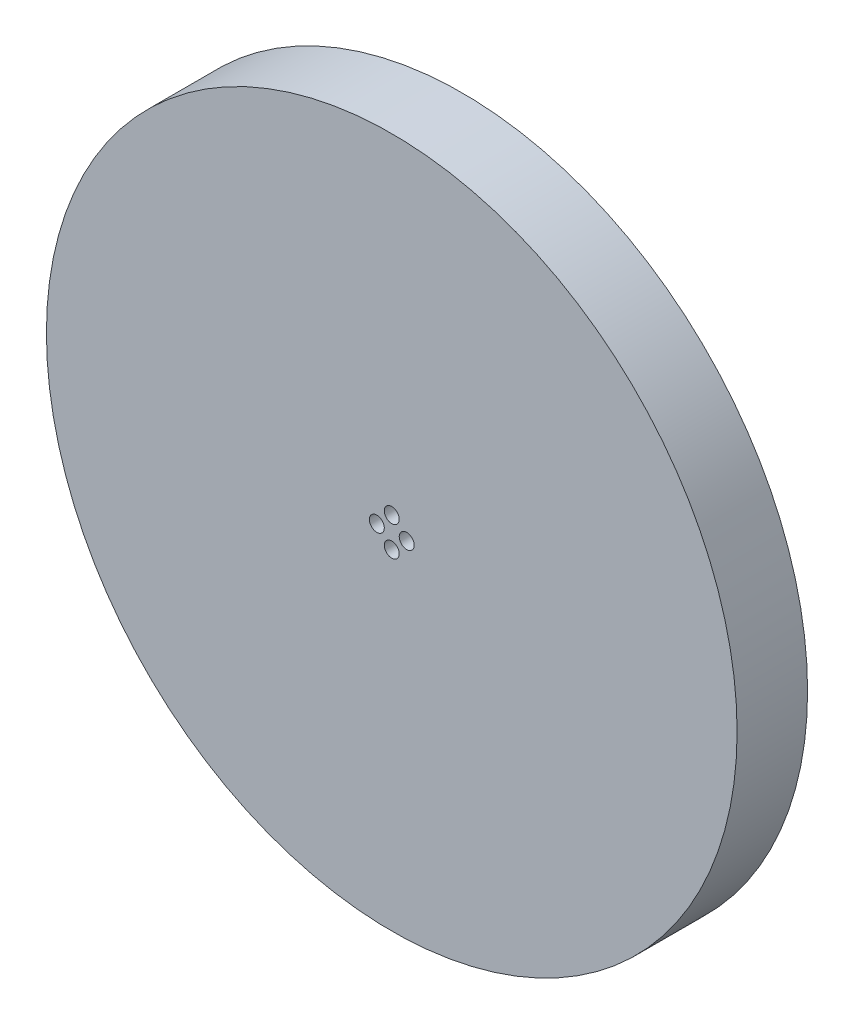
ISO-10303-21;
HEADER;
FILE_DESCRIPTION(('STEP AP214'),'2;1');
FILE_NAME('part.step','',(''),(''),'','','');
FILE_SCHEMA(('AUTOMOTIVE_DESIGN { 1 0 10303 214 1 1 1 1 }'));
ENDSEC;
DATA;
#1=APPLICATION_CONTEXT('core data for automotive mechanical design processes');
#2=APPLICATION_PROTOCOL_DEFINITION('international standard','automotive_design',2000,#1);
#3=PRODUCT_CONTEXT('',#1,'mechanical');
#4=PRODUCT('Part','Part','',(#3));
#5=PRODUCT_RELATED_PRODUCT_CATEGORY('part','',(#4));
#6=PRODUCT_DEFINITION_FORMATION('','',#4);
#7=PRODUCT_DEFINITION_CONTEXT('part definition',#1,'design');
#8=PRODUCT_DEFINITION('design','',#6,#7);
#9=PRODUCT_DEFINITION_SHAPE('','',#8);
#10=(LENGTH_UNIT() NAMED_UNIT(*) SI_UNIT(.MILLI.,.METRE.));
#11=(NAMED_UNIT(*) PLANE_ANGLE_UNIT() SI_UNIT($,.RADIAN.));
#12=(NAMED_UNIT(*) SI_UNIT($,.STERADIAN.) SOLID_ANGLE_UNIT());
#13=UNCERTAINTY_MEASURE_WITH_UNIT(LENGTH_MEASURE(1.E-05),#10,'distance_accuracy_value','');
#14=(GEOMETRIC_REPRESENTATION_CONTEXT(3) GLOBAL_UNCERTAINTY_ASSIGNED_CONTEXT((#13)) GLOBAL_UNIT_ASSIGNED_CONTEXT((#10,
#11,#12)) REPRESENTATION_CONTEXT('',''));
#15=CARTESIAN_POINT('',(0.,0.,0.));
#16=DIRECTION('',(0.,0.,1.));
#17=DIRECTION('',(1.,0.,0.));
#18=AXIS2_PLACEMENT_3D('',#15,#16,#17);
#19=CARTESIAN_POINT('',(0.,0.,5.));
#20=DIRECTION('',(0.,0.,-1.));
#21=DIRECTION('',(-1.,0.,0.));
#22=AXIS2_PLACEMENT_3D('',#19,#20,#21);
#23=CYLINDRICAL_SURFACE('',#22,24.5);
#24=CARTESIAN_POINT('',(0.,0.,5.));
#25=DIRECTION('',(0.,0.,1.));
#26=DIRECTION('',(1.,0.,0.));
#27=AXIS2_PLACEMENT_3D('',#24,#25,#26);
#28=CIRCLE('',#27,24.5);
#29=CARTESIAN_POINT('',(24.5,0.,5.));
#30=VERTEX_POINT('',#29);
#31=EDGE_CURVE('E10',#30,#30,#28,.T.);
#32=ORIENTED_EDGE('',*,*,#31,.F.);
#33=EDGE_LOOP('',(#32));
#34=FACE_BOUND('',#33,.T.);
#35=CARTESIAN_POINT('',(0.,0.,0.));
#36=DIRECTION('',(0.,0.,1.));
#37=DIRECTION('',(1.,0.,0.));
#38=AXIS2_PLACEMENT_3D('',#35,#36,#37);
#39=CIRCLE('',#38,24.5);
#40=CARTESIAN_POINT('',(24.5,0.,0.));
#41=VERTEX_POINT('',#40);
#42=EDGE_CURVE('E42',#41,#41,#39,.T.);
#43=ORIENTED_EDGE('',*,*,#42,.T.);
#44=EDGE_LOOP('',(#43));
#45=FACE_BOUND('',#44,.T.);
#46=ADVANCED_FACE('F39',(#34,#45),#23,.T.);
#47=CARTESIAN_POINT('',(0.,0.,5.));
#48=DIRECTION('',(0.,0.,1.));
#49=DIRECTION('',(1.,0.,0.));
#50=AXIS2_PLACEMENT_3D('',#47,#48,#49);
#51=PLANE('',#50);
#52=CARTESIAN_POINT('',(0.,-1.06,5.));
#53=DIRECTION('',(0.,0.,1.));
#54=DIRECTION('',(-1.,0.,0.));
#55=AXIS2_PLACEMENT_3D('',#52,#53,#54);
#56=CIRCLE('',#55,0.53);
#57=CARTESIAN_POINT('',(-0.53,-1.06,5.));
#58=VERTEX_POINT('',#57);
#59=EDGE_CURVE('E68',#58,#58,#56,.T.);
#60=ORIENTED_EDGE('',*,*,#59,.F.);
#61=EDGE_LOOP('',(#60));
#62=FACE_BOUND('',#61,.T.);
#63=CARTESIAN_POINT('',(-1.06,0.,5.));
#64=DIRECTION('',(0.,0.,1.));
#65=DIRECTION('',(0.,1.,0.));
#66=AXIS2_PLACEMENT_3D('',#63,#64,#65);
#67=CIRCLE('',#66,0.53);
#68=CARTESIAN_POINT('',(-1.05999999999999,0.530000000000011,5.));
#69=VERTEX_POINT('',#68);
#70=EDGE_CURVE('E76',#69,#69,#67,.T.);
#71=ORIENTED_EDGE('',*,*,#70,.F.);
#72=EDGE_LOOP('',(#71));
#73=FACE_BOUND('',#72,.T.);
#74=CARTESIAN_POINT('',(1.06,0.,5.));
#75=DIRECTION('',(0.,0.,1.));
#76=DIRECTION('',(0.,-1.,0.));
#77=AXIS2_PLACEMENT_3D('',#74,#75,#76);
#78=CIRCLE('',#77,0.53);
#79=CARTESIAN_POINT('',(1.06,-0.530000000000004,5.));
#80=VERTEX_POINT('',#79);
#81=EDGE_CURVE('E60',#80,#80,#78,.T.);
#82=ORIENTED_EDGE('',*,*,#81,.F.);
#83=EDGE_LOOP('',(#82));
#84=FACE_BOUND('',#83,.T.);
#85=CARTESIAN_POINT('',(0.,1.06,5.));
#86=DIRECTION('',(0.,0.,1.));
#87=DIRECTION('',(1.,0.,0.));
#88=AXIS2_PLACEMENT_3D('',#85,#86,#87);
#89=CIRCLE('',#88,0.53);
#90=CARTESIAN_POINT('',(0.53,1.06,5.));
#91=VERTEX_POINT('',#90);
#92=EDGE_CURVE('E56',#91,#91,#89,.T.);
#93=ORIENTED_EDGE('',*,*,#92,.F.);
#94=EDGE_LOOP('',(#93));
#95=FACE_BOUND('',#94,.T.);
#96=ORIENTED_EDGE('',*,*,#31,.T.);
#97=EDGE_LOOP('',(#96));
#98=FACE_BOUND('',#97,.T.);
#99=ADVANCED_FACE('F92',(#62,#73,#84,#95,#98),#51,.T.);
#100=CARTESIAN_POINT('',(0.,0.,0.));
#101=DIRECTION('',(0.,0.,1.));
#102=DIRECTION('',(1.,0.,0.));
#103=AXIS2_PLACEMENT_3D('',#100,#101,#102);
#104=PLANE('',#103);
#105=CARTESIAN_POINT('',(0.,-1.06,0.));
#106=DIRECTION('',(0.,0.,1.));
#107=DIRECTION('',(-1.,0.,0.));
#108=AXIS2_PLACEMENT_3D('',#105,#106,#107);
#109=CIRCLE('',#108,0.53);
#110=CARTESIAN_POINT('',(-0.53,-1.06,0.));
#111=VERTEX_POINT('',#110);
#112=EDGE_CURVE('E72',#111,#111,#109,.F.);
#113=ORIENTED_EDGE('',*,*,#112,.F.);
#114=EDGE_LOOP('',(#113));
#115=FACE_BOUND('',#114,.T.);
#116=CARTESIAN_POINT('',(-1.06,0.,0.));
#117=DIRECTION('',(0.,0.,1.));
#118=DIRECTION('',(0.,1.,0.));
#119=AXIS2_PLACEMENT_3D('',#116,#117,#118);
#120=CIRCLE('',#119,0.53);
#121=CARTESIAN_POINT('',(-1.05999999999999,0.530000000000011,0.));
#122=VERTEX_POINT('',#121);
#123=EDGE_CURVE('E80',#122,#122,#120,.F.);
#124=ORIENTED_EDGE('',*,*,#123,.F.);
#125=EDGE_LOOP('',(#124));
#126=FACE_BOUND('',#125,.T.);
#127=CARTESIAN_POINT('',(1.06,0.,0.));
#128=DIRECTION('',(0.,0.,1.));
#129=DIRECTION('',(0.,-1.,0.));
#130=AXIS2_PLACEMENT_3D('',#127,#128,#129);
#131=CIRCLE('',#130,0.53);
#132=CARTESIAN_POINT('',(1.06,-0.530000000000004,0.));
#133=VERTEX_POINT('',#132);
#134=EDGE_CURVE('E64',#133,#133,#131,.F.);
#135=ORIENTED_EDGE('',*,*,#134,.F.);
#136=EDGE_LOOP('',(#135));
#137=FACE_BOUND('',#136,.T.);
#138=CARTESIAN_POINT('',(0.,1.06,0.));
#139=DIRECTION('',(0.,0.,1.));
#140=DIRECTION('',(1.,0.,0.));
#141=AXIS2_PLACEMENT_3D('',#138,#139,#140);
#142=CIRCLE('',#141,0.53);
#143=CARTESIAN_POINT('',(0.53,1.06,0.));
#144=VERTEX_POINT('',#143);
#145=EDGE_CURVE('E51',#144,#144,#142,.F.);
#146=ORIENTED_EDGE('',*,*,#145,.F.);
#147=EDGE_LOOP('',(#146));
#148=FACE_BOUND('',#147,.T.);
#149=ORIENTED_EDGE('',*,*,#42,.F.);
#150=EDGE_LOOP('',(#149));
#151=FACE_BOUND('',#150,.T.);
#152=ADVANCED_FACE('F88',(#115,#126,#137,#148,#151),#104,.F.);
#153=CARTESIAN_POINT('',(0.,1.06,-1.49906637611548));
#154=DIRECTION('',(0.,0.,1.));
#155=DIRECTION('',(1.,0.,0.));
#156=AXIS2_PLACEMENT_3D('',#153,#154,#155);
#157=CYLINDRICAL_SURFACE('',#156,0.53);
#158=ORIENTED_EDGE('',*,*,#145,.T.);
#159=EDGE_LOOP('',(#158));
#160=FACE_BOUND('',#159,.T.);
#161=ORIENTED_EDGE('',*,*,#92,.T.);
#162=EDGE_LOOP('',(#161));
#163=FACE_BOUND('',#162,.T.);
#164=ADVANCED_FACE('F91',(#160,#163),#157,.F.);
#165=CARTESIAN_POINT('',(1.06,0.,-1.49906637611548));
#166=DIRECTION('',(0.,0.,1.));
#167=DIRECTION('',(0.,-1.,0.));
#168=AXIS2_PLACEMENT_3D('',#165,#166,#167);
#169=CYLINDRICAL_SURFACE('',#168,0.53);
#170=ORIENTED_EDGE('',*,*,#134,.T.);
#171=EDGE_LOOP('',(#170));
#172=FACE_BOUND('',#171,.T.);
#173=ORIENTED_EDGE('',*,*,#81,.T.);
#174=EDGE_LOOP('',(#173));
#175=FACE_BOUND('',#174,.T.);
#176=ADVANCED_FACE('F114',(#172,#175),#169,.F.);
#177=CARTESIAN_POINT('',(-1.06,0.,-1.49906637611548));
#178=DIRECTION('',(0.,0.,1.));
#179=DIRECTION('',(0.,1.,0.));
#180=AXIS2_PLACEMENT_3D('',#177,#178,#179);
#181=CYLINDRICAL_SURFACE('',#180,0.53);
#182=ORIENTED_EDGE('',*,*,#123,.T.);
#183=EDGE_LOOP('',(#182));
#184=FACE_BOUND('',#183,.T.);
#185=ORIENTED_EDGE('',*,*,#70,.T.);
#186=EDGE_LOOP('',(#185));
#187=FACE_BOUND('',#186,.T.);
#188=ADVANCED_FACE('F85',(#184,#187),#181,.F.);
#189=CARTESIAN_POINT('',(0.,-1.06,-1.49906637611548));
#190=DIRECTION('',(0.,0.,1.));
#191=DIRECTION('',(-1.,0.,0.));
#192=AXIS2_PLACEMENT_3D('',#189,#190,#191);
#193=CYLINDRICAL_SURFACE('',#192,0.53);
#194=ORIENTED_EDGE('',*,*,#112,.T.);
#195=EDGE_LOOP('',(#194));
#196=FACE_BOUND('',#195,.T.);
#197=ORIENTED_EDGE('',*,*,#59,.T.);
#198=EDGE_LOOP('',(#197));
#199=FACE_BOUND('',#198,.T.);
#200=ADVANCED_FACE('F119',(#196,#199),#193,.F.);
#201=CLOSED_SHELL('',(#46,#99,#152,#164,#176,#188,#200));
#202=MANIFOLD_SOLID_BREP('B2',#201);
#203=ADVANCED_BREP_SHAPE_REPRESENTATION('',(#18,#202),#14);
#204=SHAPE_DEFINITION_REPRESENTATION(#9,#203);
ENDSEC;
END-ISO-10303-21;
